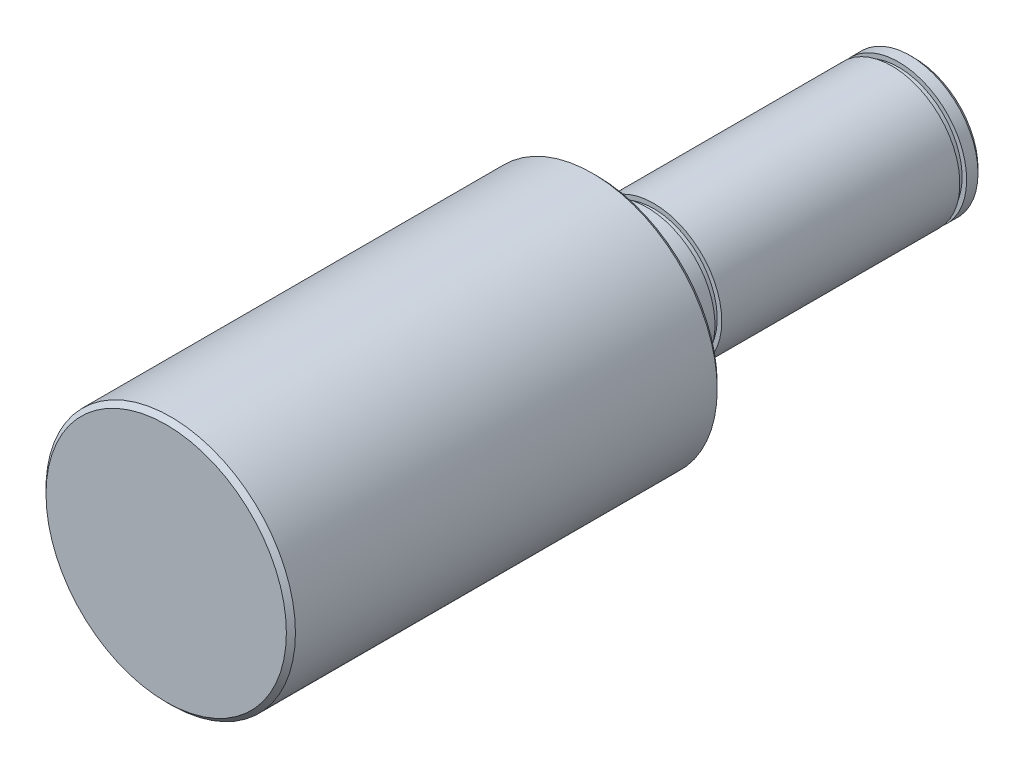
ISO-10303-21;
HEADER;
FILE_DESCRIPTION(('STEP AP214'),'2;1');
FILE_NAME('part.step','',(''),(''),'','','');
FILE_SCHEMA(('AUTOMOTIVE_DESIGN { 1 0 10303 214 1 1 1 1 }'));
ENDSEC;
DATA;
#1=APPLICATION_CONTEXT('core data for automotive mechanical design processes');
#2=APPLICATION_PROTOCOL_DEFINITION('international standard','automotive_design',2000,#1);
#3=PRODUCT_CONTEXT('',#1,'mechanical');
#4=PRODUCT('Part','Part','',(#3));
#5=PRODUCT_RELATED_PRODUCT_CATEGORY('part','',(#4));
#6=PRODUCT_DEFINITION_FORMATION('','',#4);
#7=PRODUCT_DEFINITION_CONTEXT('part definition',#1,'design');
#8=PRODUCT_DEFINITION('design','',#6,#7);
#9=PRODUCT_DEFINITION_SHAPE('','',#8);
#10=(LENGTH_UNIT() NAMED_UNIT(*) SI_UNIT(.MILLI.,.METRE.));
#11=(NAMED_UNIT(*) PLANE_ANGLE_UNIT() SI_UNIT($,.RADIAN.));
#12=(NAMED_UNIT(*) SI_UNIT($,.STERADIAN.) SOLID_ANGLE_UNIT());
#13=UNCERTAINTY_MEASURE_WITH_UNIT(LENGTH_MEASURE(1.E-05),#10,'distance_accuracy_value','');
#14=(GEOMETRIC_REPRESENTATION_CONTEXT(3) GLOBAL_UNCERTAINTY_ASSIGNED_CONTEXT((#13)) GLOBAL_UNIT_ASSIGNED_CONTEXT((#10,
#11,#12)) REPRESENTATION_CONTEXT('',''));
#15=CARTESIAN_POINT('',(0.,0.,0.));
#16=DIRECTION('',(0.,0.,1.));
#17=DIRECTION('',(1.,0.,0.));
#18=AXIS2_PLACEMENT_3D('',#15,#16,#17);
#19=CARTESIAN_POINT('',(0.,0.,70.));
#20=DIRECTION('',(0.,0.,-1.));
#21=DIRECTION('',(-1.,0.,0.));
#22=AXIS2_PLACEMENT_3D('',#19,#20,#21);
#23=CYLINDRICAL_SURFACE('',#22,15.);
#24=CARTESIAN_POINT('',(0.,0.,57.5));
#25=DIRECTION('',(0.,0.,1.));
#26=DIRECTION('',(1.,0.,0.));
#27=AXIS2_PLACEMENT_3D('',#24,#25,#26);
#28=CIRCLE('',#27,15.);
#29=CARTESIAN_POINT('',(15.,0.,57.5));
#30=VERTEX_POINT('',#29);
#31=EDGE_CURVE('E51',#30,#30,#28,.T.);
#32=ORIENTED_EDGE('',*,*,#31,.F.);
#33=EDGE_LOOP('',(#32));
#34=FACE_BOUND('',#33,.T.);
#35=CARTESIAN_POINT('',(0.,0.,5.));
#36=DIRECTION('',(0.,0.,-1.));
#37=DIRECTION('',(-1.,0.,0.));
#38=AXIS2_PLACEMENT_3D('',#35,#36,#37);
#39=CIRCLE('',#38,15.);
#40=CARTESIAN_POINT('',(-15.,0.,5.));
#41=VERTEX_POINT('',#40);
#42=EDGE_CURVE('E38',#41,#41,#39,.T.);
#43=ORIENTED_EDGE('',*,*,#42,.F.);
#44=EDGE_LOOP('',(#43));
#45=FACE_BOUND('',#44,.T.);
#46=ADVANCED_FACE('F34',(#34,#45),#23,.T.);
#47=CARTESIAN_POINT('',(0.,0.,70.));
#48=DIRECTION('',(0.,0.,1.));
#49=DIRECTION('',(1.,0.,0.));
#50=AXIS2_PLACEMENT_3D('',#47,#48,#49);
#51=CIRCLE('',#50,15.);
#52=CARTESIAN_POINT('',(15.,0.,70.));
#53=VERTEX_POINT('',#52);
#54=EDGE_CURVE('E57',#53,#53,#51,.T.);
#55=ORIENTED_EDGE('',*,*,#54,.F.);
#56=EDGE_LOOP('',(#55));
#57=FACE_BOUND('',#56,.T.);
#58=CARTESIAN_POINT('',(0.,0.,59.));
#59=DIRECTION('',(0.,0.,-1.));
#60=DIRECTION('',(-1.,0.,0.));
#61=AXIS2_PLACEMENT_3D('',#58,#59,#60);
#62=CIRCLE('',#61,15.);
#63=CARTESIAN_POINT('',(-15.,0.,59.));
#64=VERTEX_POINT('',#63);
#65=EDGE_CURVE('E54',#64,#64,#62,.T.);
#66=ORIENTED_EDGE('',*,*,#65,.F.);
#67=EDGE_LOOP('',(#66));
#68=FACE_BOUND('',#67,.T.);
#69=ADVANCED_FACE('F111',(#57,#68),#23,.T.);
#70=CARTESIAN_POINT('',(0.,0.,70.));
#71=DIRECTION('',(0.,0.,1.));
#72=DIRECTION('',(1.,0.,0.));
#73=AXIS2_PLACEMENT_3D('',#70,#71,#72);
#74=PLANE('',#73);
#75=CARTESIAN_POINT('',(0.,0.,70.));
#76=DIRECTION('',(0.,0.,1.));
#77=DIRECTION('',(1.,0.,0.));
#78=AXIS2_PLACEMENT_3D('',#75,#76,#77);
#79=CIRCLE('',#78,26.5);
#80=CARTESIAN_POINT('',(26.5,0.,70.));
#81=VERTEX_POINT('',#80);
#82=EDGE_CURVE('E47',#81,#81,#79,.F.);
#83=ORIENTED_EDGE('',*,*,#82,.T.);
#84=EDGE_LOOP('',(#83));
#85=FACE_BOUND('',#84,.T.);
#86=ORIENTED_EDGE('',*,*,#54,.T.);
#87=EDGE_LOOP('',(#86));
#88=FACE_BOUND('',#87,.T.);
#89=ADVANCED_FACE('F90',(#85,#88),#74,.F.);
#90=CARTESIAN_POINT('',(0.,0.,165.));
#91=DIRECTION('',(0.,0.,-1.));
#92=DIRECTION('',(-1.,0.,0.));
#93=AXIS2_PLACEMENT_3D('',#90,#91,#92);
#94=CYLINDRICAL_SURFACE('',#93,27.5);
#95=CARTESIAN_POINT('',(0.,0.,164.));
#96=DIRECTION('',(0.,0.,1.));
#97=DIRECTION('',(1.,0.,0.));
#98=AXIS2_PLACEMENT_3D('',#95,#96,#97);
#99=CIRCLE('',#98,27.5);
#100=CARTESIAN_POINT('',(27.5,0.,164.));
#101=VERTEX_POINT('',#100);
#102=EDGE_CURVE('E85',#101,#101,#99,.F.);
#103=ORIENTED_EDGE('',*,*,#102,.T.);
#104=EDGE_LOOP('',(#103));
#105=FACE_BOUND('',#104,.T.);
#106=CARTESIAN_POINT('',(0.,0.,71.));
#107=DIRECTION('',(0.,0.,1.));
#108=DIRECTION('',(1.,0.,0.));
#109=AXIS2_PLACEMENT_3D('',#106,#107,#108);
#110=CIRCLE('',#109,27.5);
#111=CARTESIAN_POINT('',(27.5,0.,71.));
#112=VERTEX_POINT('',#111);
#113=EDGE_CURVE('E82',#112,#112,#110,.T.);
#114=ORIENTED_EDGE('',*,*,#113,.T.);
#115=EDGE_LOOP('',(#114));
#116=FACE_BOUND('',#115,.T.);
#117=ADVANCED_FACE('F100',(#105,#116),#94,.T.);
#118=CARTESIAN_POINT('',(0.,0.,165.));
#119=DIRECTION('',(0.,0.,1.));
#120=DIRECTION('',(1.,0.,0.));
#121=AXIS2_PLACEMENT_3D('',#118,#119,#120);
#122=PLANE('',#121);
#123=CARTESIAN_POINT('',(0.,0.,165.));
#124=DIRECTION('',(0.,0.,1.));
#125=DIRECTION('',(1.,0.,0.));
#126=AXIS2_PLACEMENT_3D('',#123,#124,#125);
#127=CIRCLE('',#126,26.5);
#128=CARTESIAN_POINT('',(26.5,0.,165.));
#129=VERTEX_POINT('',#128);
#130=EDGE_CURVE('E79',#129,#129,#127,.T.);
#131=ORIENTED_EDGE('',*,*,#130,.T.);
#132=EDGE_LOOP('',(#131));
#133=FACE_BOUND('',#132,.T.);
#134=ADVANCED_FACE('F102',(#133),#122,.T.);
#135=CARTESIAN_POINT('',(0.,0.,165.));
#136=DIRECTION('',(0.,0.,-1.));
#137=DIRECTION('',(-1.,0.,0.));
#138=AXIS2_PLACEMENT_3D('',#135,#136,#137);
#139=CONICAL_SURFACE('',#138,26.5,0.785398163397464);
#140=ORIENTED_EDGE('',*,*,#102,.F.);
#141=EDGE_LOOP('',(#140));
#142=FACE_BOUND('',#141,.T.);
#143=ORIENTED_EDGE('',*,*,#130,.F.);
#144=EDGE_LOOP('',(#143));
#145=FACE_BOUND('',#144,.T.);
#146=ADVANCED_FACE('F97',(#142,#145),#139,.T.);
#147=CARTESIAN_POINT('',(0.,0.,71.));
#148=DIRECTION('',(0.,0.,1.));
#149=DIRECTION('',(1.,0.,0.));
#150=AXIS2_PLACEMENT_3D('',#147,#148,#149);
#151=CONICAL_SURFACE('',#150,27.5,0.78539816339745);
#152=ORIENTED_EDGE('',*,*,#82,.F.);
#153=EDGE_LOOP('',(#152));
#154=FACE_BOUND('',#153,.T.);
#155=ORIENTED_EDGE('',*,*,#113,.F.);
#156=EDGE_LOOP('',(#155));
#157=FACE_BOUND('',#156,.T.);
#158=ADVANCED_FACE('F93',(#154,#157),#151,.T.);
#159=CARTESIAN_POINT('',(14.,0.,59.));
#160=DIRECTION('',(0.,0.,-1.));
#161=DIRECTION('',(-1.,0.,0.));
#162=AXIS2_PLACEMENT_3D('',#159,#160,#161);
#163=PLANE('',#162);
#164=CARTESIAN_POINT('',(0.,0.,59.));
#165=DIRECTION('',(0.,0.,-1.));
#166=DIRECTION('',(-1.,0.,0.));
#167=AXIS2_PLACEMENT_3D('',#164,#165,#166);
#168=CIRCLE('',#167,14.);
#169=CARTESIAN_POINT('',(-14.,0.,59.));
#170=VERTEX_POINT('',#169);
#171=EDGE_CURVE('E55',#170,#170,#168,.T.);
#172=ORIENTED_EDGE('',*,*,#171,.F.);
#173=EDGE_LOOP('',(#172));
#174=FACE_BOUND('',#173,.T.);
#175=ORIENTED_EDGE('',*,*,#65,.T.);
#176=EDGE_LOOP('',(#175));
#177=FACE_BOUND('',#176,.T.);
#178=ADVANCED_FACE('F96',(#174,#177),#163,.T.);
#179=CARTESIAN_POINT('',(14.,0.,57.5));
#180=DIRECTION('',(0.,0.,1.));
#181=DIRECTION('',(1.,0.,0.));
#182=AXIS2_PLACEMENT_3D('',#179,#180,#181);
#183=PLANE('',#182);
#184=CARTESIAN_POINT('',(0.,0.,57.5));
#185=DIRECTION('',(0.,0.,-1.));
#186=DIRECTION('',(-1.,0.,0.));
#187=AXIS2_PLACEMENT_3D('',#184,#185,#186);
#188=CIRCLE('',#187,14.);
#189=CARTESIAN_POINT('',(-14.,0.,57.5));
#190=VERTEX_POINT('',#189);
#191=EDGE_CURVE('E64',#190,#190,#188,.T.);
#192=ORIENTED_EDGE('',*,*,#191,.T.);
#193=EDGE_LOOP('',(#192));
#194=FACE_BOUND('',#193,.T.);
#195=ORIENTED_EDGE('',*,*,#31,.T.);
#196=EDGE_LOOP('',(#195));
#197=FACE_BOUND('',#196,.T.);
#198=ADVANCED_FACE('F153',(#194,#197),#183,.T.);
#199=CARTESIAN_POINT('',(0.,0.,-18.2150481651675));
#200=DIRECTION('',(0.,0.,-1.));
#201=DIRECTION('',(-1.,0.,0.));
#202=AXIS2_PLACEMENT_3D('',#199,#200,#201);
#203=CYLINDRICAL_SURFACE('',#202,14.);
#204=ORIENTED_EDGE('',*,*,#171,.T.);
#205=EDGE_LOOP('',(#204));
#206=FACE_BOUND('',#205,.T.);
#207=ORIENTED_EDGE('',*,*,#191,.F.);
#208=EDGE_LOOP('',(#207));
#209=FACE_BOUND('',#208,.T.);
#210=ADVANCED_FACE('F156',(#206,#209),#203,.T.);
#211=CARTESIAN_POINT('',(14.,0.,5.));
#212=DIRECTION('',(0.,0.,-1.));
#213=DIRECTION('',(-1.,0.,0.));
#214=AXIS2_PLACEMENT_3D('',#211,#212,#213);
#215=PLANE('',#214);
#216=CARTESIAN_POINT('',(0.,0.,5.));
#217=DIRECTION('',(0.,0.,-1.));
#218=DIRECTION('',(-1.,0.,0.));
#219=AXIS2_PLACEMENT_3D('',#216,#217,#218);
#220=CIRCLE('',#219,14.);
#221=CARTESIAN_POINT('',(-14.,0.,5.));
#222=VERTEX_POINT('',#221);
#223=EDGE_CURVE('E60',#222,#222,#220,.T.);
#224=ORIENTED_EDGE('',*,*,#223,.F.);
#225=EDGE_LOOP('',(#224));
#226=FACE_BOUND('',#225,.T.);
#227=ORIENTED_EDGE('',*,*,#42,.T.);
#228=EDGE_LOOP('',(#227));
#229=FACE_BOUND('',#228,.T.);
#230=ADVANCED_FACE('F147',(#226,#229),#215,.T.);
#231=CARTESIAN_POINT('',(14.,0.,3.5));
#232=DIRECTION('',(0.,0.,1.));
#233=DIRECTION('',(1.,0.,0.));
#234=AXIS2_PLACEMENT_3D('',#231,#232,#233);
#235=PLANE('',#234);
#236=CARTESIAN_POINT('',(0.,0.,3.5));
#237=DIRECTION('',(0.,0.,-1.));
#238=DIRECTION('',(-1.,0.,0.));
#239=AXIS2_PLACEMENT_3D('',#236,#237,#238);
#240=CIRCLE('',#239,14.);
#241=CARTESIAN_POINT('',(-14.,0.,3.5));
#242=VERTEX_POINT('',#241);
#243=EDGE_CURVE('E66',#242,#242,#240,.T.);
#244=ORIENTED_EDGE('',*,*,#243,.T.);
#245=EDGE_LOOP('',(#244));
#246=FACE_BOUND('',#245,.T.);
#247=CARTESIAN_POINT('',(0.,0.,3.5));
#248=DIRECTION('',(0.,0.,1.));
#249=DIRECTION('',(1.,0.,0.));
#250=AXIS2_PLACEMENT_3D('',#247,#248,#249);
#251=CIRCLE('',#250,15.);
#252=CARTESIAN_POINT('',(15.,0.,3.5));
#253=VERTEX_POINT('',#252);
#254=EDGE_CURVE('E58',#253,#253,#251,.T.);
#255=ORIENTED_EDGE('',*,*,#254,.T.);
#256=EDGE_LOOP('',(#255));
#257=FACE_BOUND('',#256,.T.);
#258=ADVANCED_FACE('F142',(#246,#257),#235,.T.);
#259=CARTESIAN_POINT('',(0.,0.,-18.2150481651675));
#260=DIRECTION('',(0.,0.,-1.));
#261=DIRECTION('',(-1.,0.,0.));
#262=AXIS2_PLACEMENT_3D('',#259,#260,#261);
#263=CYLINDRICAL_SURFACE('',#262,14.);
#264=ORIENTED_EDGE('',*,*,#223,.T.);
#265=EDGE_LOOP('',(#264));
#266=FACE_BOUND('',#265,.T.);
#267=ORIENTED_EDGE('',*,*,#243,.F.);
#268=EDGE_LOOP('',(#267));
#269=FACE_BOUND('',#268,.T.);
#270=ADVANCED_FACE('F138',(#266,#269),#263,.T.);
#271=CARTESIAN_POINT('',(0.,0.,0.));
#272=DIRECTION('',(0.,0.,1.));
#273=DIRECTION('',(1.,0.,0.));
#274=AXIS2_PLACEMENT_3D('',#271,#272,#273);
#275=PLANE('',#274);
#276=CARTESIAN_POINT('',(0.,0.,0.));
#277=DIRECTION('',(0.,0.,1.));
#278=DIRECTION('',(1.,0.,0.));
#279=AXIS2_PLACEMENT_3D('',#276,#277,#278);
#280=CIRCLE('',#279,14.);
#281=CARTESIAN_POINT('',(14.,0.,0.));
#282=VERTEX_POINT('',#281);
#283=EDGE_CURVE('E10',#282,#282,#280,.F.);
#284=ORIENTED_EDGE('',*,*,#283,.T.);
#285=EDGE_LOOP('',(#284));
#286=FACE_BOUND('',#285,.T.);
#287=ADVANCED_FACE('F130',(#286),#275,.F.);
#288=CARTESIAN_POINT('',(0.,0.,0.999999999999973));
#289=DIRECTION('',(0.,0.,1.));
#290=DIRECTION('',(1.,0.,0.));
#291=AXIS2_PLACEMENT_3D('',#288,#289,#290);
#292=CONICAL_SURFACE('',#291,15.,0.785398163397454);
#293=ORIENTED_EDGE('',*,*,#283,.F.);
#294=EDGE_LOOP('',(#293));
#295=FACE_BOUND('',#294,.T.);
#296=CARTESIAN_POINT('',(0.,0.,0.999999999999973));
#297=DIRECTION('',(0.,0.,1.));
#298=DIRECTION('',(1.,0.,0.));
#299=AXIS2_PLACEMENT_3D('',#296,#297,#298);
#300=CIRCLE('',#299,15.);
#301=CARTESIAN_POINT('',(15.,0.,0.999999999999973));
#302=VERTEX_POINT('',#301);
#303=EDGE_CURVE('E42',#302,#302,#300,.T.);
#304=ORIENTED_EDGE('',*,*,#303,.F.);
#305=EDGE_LOOP('',(#304));
#306=FACE_BOUND('',#305,.T.);
#307=ADVANCED_FACE('F36',(#295,#306),#292,.T.);
#308=ORIENTED_EDGE('',*,*,#303,.T.);
#309=EDGE_LOOP('',(#308));
#310=FACE_BOUND('',#309,.T.);
#311=ORIENTED_EDGE('',*,*,#254,.F.);
#312=EDGE_LOOP('',(#311));
#313=FACE_BOUND('',#312,.T.);
#314=ADVANCED_FACE('F117',(#310,#313),#23,.T.);
#315=CLOSED_SHELL('',(#46,#69,#89,#117,#134,#146,#158,#178,#198,#210,#230,#258,#270,#287,#307,#314));
#316=MANIFOLD_SOLID_BREP('B2',#315);
#317=ADVANCED_BREP_SHAPE_REPRESENTATION('',(#18,#316),#14);
#318=SHAPE_DEFINITION_REPRESENTATION(#9,#317);
ENDSEC;
END-ISO-10303-21;
